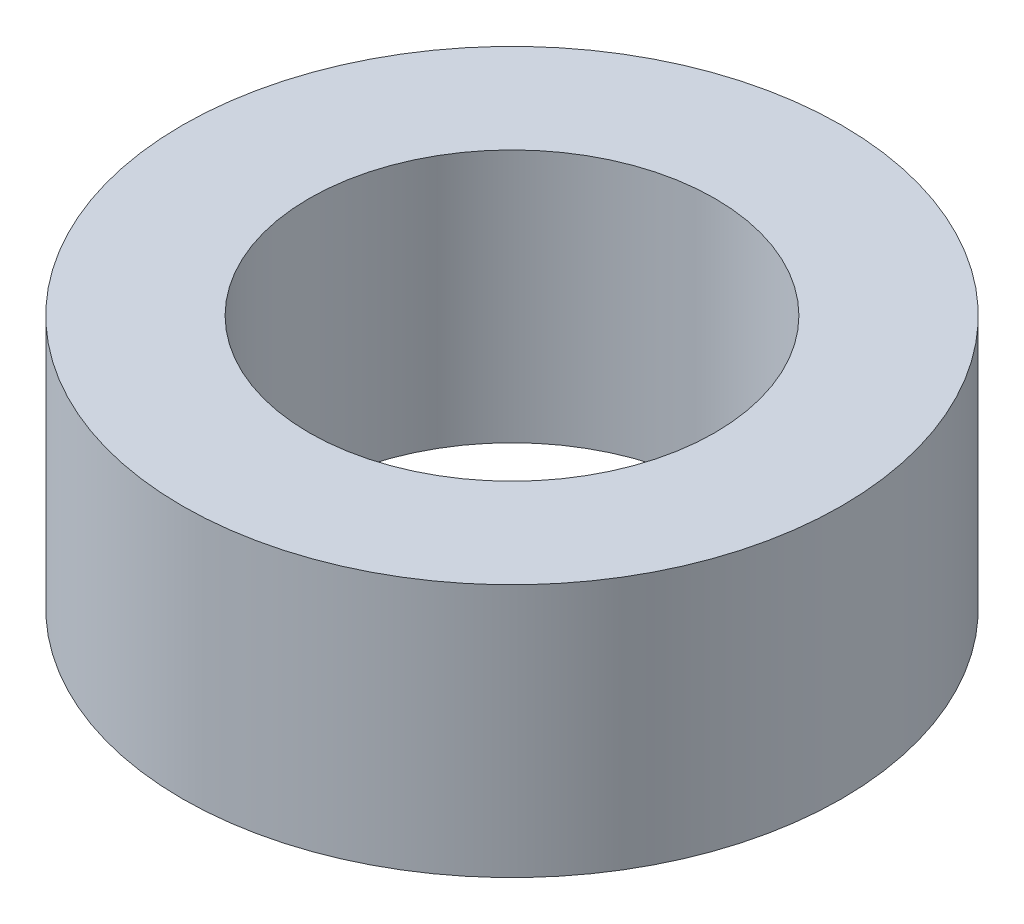
ISO-10303-21;
HEADER;
FILE_DESCRIPTION(('STEP AP214'),'2;1');
FILE_NAME('part.step','',(''),(''),'','','');
FILE_SCHEMA(('AUTOMOTIVE_DESIGN { 1 0 10303 214 1 1 1 1 }'));
ENDSEC;
DATA;
#1=APPLICATION_CONTEXT('core data for automotive mechanical design processes');
#2=APPLICATION_PROTOCOL_DEFINITION('international standard','automotive_design',2000,#1);
#3=PRODUCT_CONTEXT('',#1,'mechanical');
#4=PRODUCT('Part','Part','',(#3));
#5=PRODUCT_RELATED_PRODUCT_CATEGORY('part','',(#4));
#6=PRODUCT_DEFINITION_FORMATION('','',#4);
#7=PRODUCT_DEFINITION_CONTEXT('part definition',#1,'design');
#8=PRODUCT_DEFINITION('design','',#6,#7);
#9=PRODUCT_DEFINITION_SHAPE('','',#8);
#10=(LENGTH_UNIT() NAMED_UNIT(*) SI_UNIT(.MILLI.,.METRE.));
#11=(NAMED_UNIT(*) PLANE_ANGLE_UNIT() SI_UNIT($,.RADIAN.));
#12=(NAMED_UNIT(*) SI_UNIT($,.STERADIAN.) SOLID_ANGLE_UNIT());
#13=UNCERTAINTY_MEASURE_WITH_UNIT(LENGTH_MEASURE(1.E-05),#10,'distance_accuracy_value','');
#14=(GEOMETRIC_REPRESENTATION_CONTEXT(3) GLOBAL_UNCERTAINTY_ASSIGNED_CONTEXT((#13)) GLOBAL_UNIT_ASSIGNED_CONTEXT((#10,
#11,#12)) REPRESENTATION_CONTEXT('',''));
#15=CARTESIAN_POINT('',(0.,0.,0.));
#16=DIRECTION('',(0.,0.,1.));
#17=DIRECTION('',(1.,0.,0.));
#18=AXIS2_PLACEMENT_3D('',#15,#16,#17);
#19=CARTESIAN_POINT('',(0.,5.,0.));
#20=DIRECTION('',(0.,1.,0.));
#21=DIRECTION('',(0.,0.,1.));
#22=AXIS2_PLACEMENT_3D('',#19,#20,#21);
#23=PLANE('',#22);
#24=CARTESIAN_POINT('',(0.,5.,0.));
#25=DIRECTION('',(0.,1.,0.));
#26=DIRECTION('',(0.,0.,1.));
#27=AXIS2_PLACEMENT_3D('',#24,#25,#26);
#28=CIRCLE('',#27,6.5);
#29=CARTESIAN_POINT('',(0.,5.,6.5));
#30=VERTEX_POINT('',#29);
#31=EDGE_CURVE('E10',#30,#30,#28,.T.);
#32=ORIENTED_EDGE('',*,*,#31,.T.);
#33=EDGE_LOOP('',(#32));
#34=FACE_BOUND('',#33,.T.);
#35=CARTESIAN_POINT('',(0.,5.,0.));
#36=DIRECTION('',(0.,1.,0.));
#37=DIRECTION('',(0.,0.,1.));
#38=AXIS2_PLACEMENT_3D('',#35,#36,#37);
#39=CIRCLE('',#38,4.);
#40=CARTESIAN_POINT('',(0.,5.,4.));
#41=VERTEX_POINT('',#40);
#42=EDGE_CURVE('E42',#41,#41,#39,.T.);
#43=ORIENTED_EDGE('',*,*,#42,.F.);
#44=EDGE_LOOP('',(#43));
#45=FACE_BOUND('',#44,.T.);
#46=ADVANCED_FACE('F31',(#34,#45),#23,.T.);
#47=CARTESIAN_POINT('',(0.,0.,0.));
#48=DIRECTION('',(0.,1.,0.));
#49=DIRECTION('',(0.,0.,1.));
#50=AXIS2_PLACEMENT_3D('',#47,#48,#49);
#51=PLANE('',#50);
#52=CARTESIAN_POINT('',(0.,0.,0.));
#53=DIRECTION('',(0.,1.,0.));
#54=DIRECTION('',(0.,0.,1.));
#55=AXIS2_PLACEMENT_3D('',#52,#53,#54);
#56=CIRCLE('',#55,6.5);
#57=CARTESIAN_POINT('',(0.,0.,6.5));
#58=VERTEX_POINT('',#57);
#59=EDGE_CURVE('E35',#58,#58,#56,.T.);
#60=ORIENTED_EDGE('',*,*,#59,.F.);
#61=EDGE_LOOP('',(#60));
#62=FACE_BOUND('',#61,.T.);
#63=CARTESIAN_POINT('',(0.,0.,0.));
#64=DIRECTION('',(0.,1.,0.));
#65=DIRECTION('',(0.,0.,1.));
#66=AXIS2_PLACEMENT_3D('',#63,#64,#65);
#67=CIRCLE('',#66,4.);
#68=CARTESIAN_POINT('',(0.,0.,4.));
#69=VERTEX_POINT('',#68);
#70=EDGE_CURVE('E44',#69,#69,#67,.T.);
#71=ORIENTED_EDGE('',*,*,#70,.T.);
#72=EDGE_LOOP('',(#71));
#73=FACE_BOUND('',#72,.T.);
#74=ADVANCED_FACE('F54',(#62,#73),#51,.F.);
#75=CARTESIAN_POINT('',(0.,5.,0.));
#76=DIRECTION('',(0.,-1.,0.));
#77=DIRECTION('',(0.,0.,-1.));
#78=AXIS2_PLACEMENT_3D('',#75,#76,#77);
#79=CYLINDRICAL_SURFACE('',#78,6.5);
#80=ORIENTED_EDGE('',*,*,#31,.F.);
#81=EDGE_LOOP('',(#80));
#82=FACE_BOUND('',#81,.T.);
#83=ORIENTED_EDGE('',*,*,#59,.T.);
#84=EDGE_LOOP('',(#83));
#85=FACE_BOUND('',#84,.T.);
#86=ADVANCED_FACE('F33',(#82,#85),#79,.T.);
#87=CARTESIAN_POINT('',(0.,5.,0.));
#88=DIRECTION('',(0.,-1.,0.));
#89=DIRECTION('',(0.,0.,-1.));
#90=AXIS2_PLACEMENT_3D('',#87,#88,#89);
#91=CYLINDRICAL_SURFACE('',#90,4.);
#92=ORIENTED_EDGE('',*,*,#42,.T.);
#93=EDGE_LOOP('',(#92));
#94=FACE_BOUND('',#93,.T.);
#95=ORIENTED_EDGE('',*,*,#70,.F.);
#96=EDGE_LOOP('',(#95));
#97=FACE_BOUND('',#96,.T.);
#98=ADVANCED_FACE('F50',(#94,#97),#91,.F.);
#99=CLOSED_SHELL('',(#46,#74,#86,#98));
#100=MANIFOLD_SOLID_BREP('B2',#99);
#101=ADVANCED_BREP_SHAPE_REPRESENTATION('',(#18,#100),#14);
#102=SHAPE_DEFINITION_REPRESENTATION(#9,#101);
ENDSEC;
END-ISO-10303-21;
